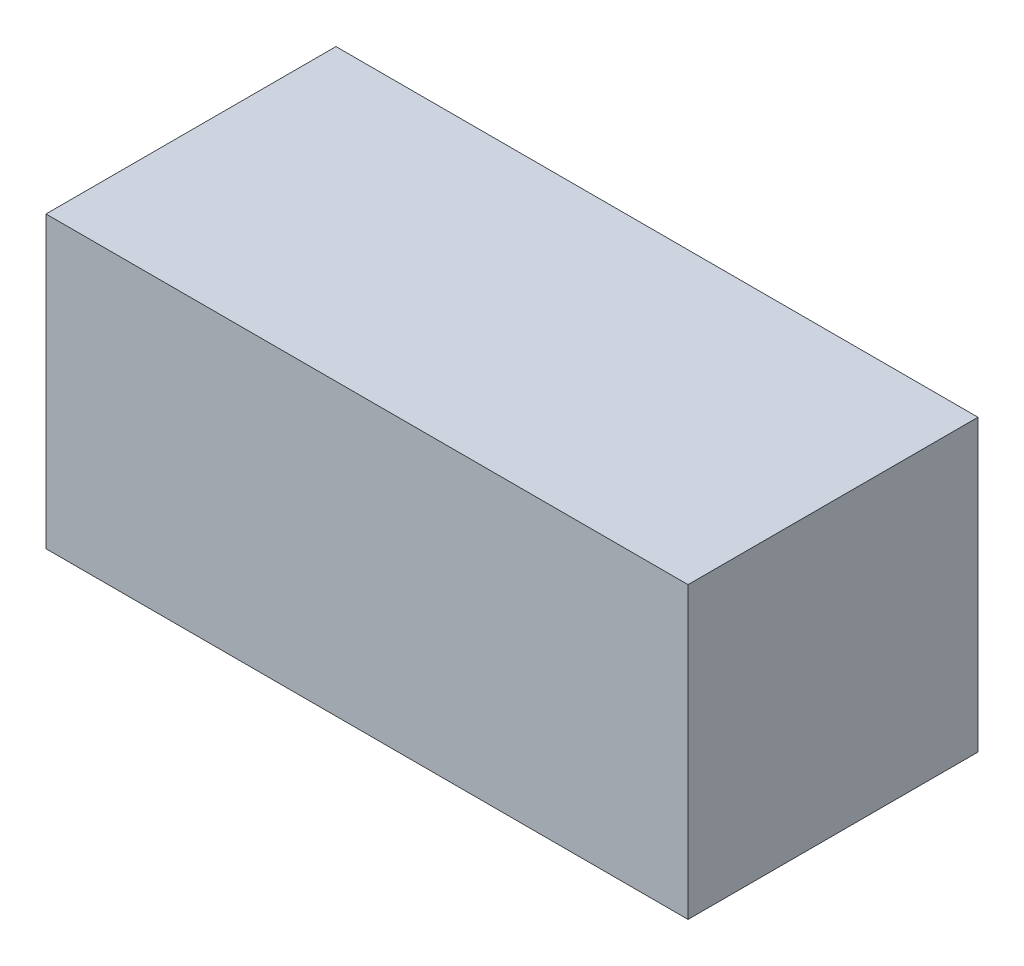
ISO-10303-21;
HEADER;
FILE_DESCRIPTION(('STEP AP214'),'2;1');
FILE_NAME('part.step','',(''),(''),'','','');
FILE_SCHEMA(('AUTOMOTIVE_DESIGN { 1 0 10303 214 1 1 1 1 }'));
ENDSEC;
DATA;
#1=APPLICATION_CONTEXT('core data for automotive mechanical design processes');
#2=APPLICATION_PROTOCOL_DEFINITION('international standard','automotive_design',2000,#1);
#3=PRODUCT_CONTEXT('',#1,'mechanical');
#4=PRODUCT('Part','Part','',(#3));
#5=PRODUCT_RELATED_PRODUCT_CATEGORY('part','',(#4));
#6=PRODUCT_DEFINITION_FORMATION('','',#4);
#7=PRODUCT_DEFINITION_CONTEXT('part definition',#1,'design');
#8=PRODUCT_DEFINITION('design','',#6,#7);
#9=PRODUCT_DEFINITION_SHAPE('','',#8);
#10=(LENGTH_UNIT() NAMED_UNIT(*) SI_UNIT(.MILLI.,.METRE.));
#11=(NAMED_UNIT(*) PLANE_ANGLE_UNIT() SI_UNIT($,.RADIAN.));
#12=(NAMED_UNIT(*) SI_UNIT($,.STERADIAN.) SOLID_ANGLE_UNIT());
#13=UNCERTAINTY_MEASURE_WITH_UNIT(LENGTH_MEASURE(1.E-05),#10,'distance_accuracy_value','');
#14=(GEOMETRIC_REPRESENTATION_CONTEXT(3) GLOBAL_UNCERTAINTY_ASSIGNED_CONTEXT((#13)) GLOBAL_UNIT_ASSIGNED_CONTEXT((#10,
#11,#12)) REPRESENTATION_CONTEXT('',''));
#15=CARTESIAN_POINT('',(0.,0.,0.));
#16=DIRECTION('',(0.,0.,1.));
#17=DIRECTION('',(1.,0.,0.));
#18=AXIS2_PLACEMENT_3D('',#15,#16,#17);
#19=CARTESIAN_POINT('',(-65.1146492550486,23.6367837338263,70.));
#20=DIRECTION('',(1.,0.,0.));
#21=DIRECTION('',(0.,1.,0.));
#22=AXIS2_PLACEMENT_3D('',#19,#20,#21);
#23=PLANE('',#22);
#24=DIRECTION('',(0.,0.,-1.));
#25=VECTOR('',#24,1.);
#26=CARTESIAN_POINT('',(-65.1146492550486,19.6367837338263,66.));
#27=LINE('',#26,#25);
#28=CARTESIAN_POINT('',(-65.1146492550486,19.6367837338263,66.));
#29=VERTEX_POINT('',#28);
#30=CARTESIAN_POINT('',(-65.1146492550486,19.6367837338263,4.));
#31=VERTEX_POINT('',#30);
#32=EDGE_CURVE('E154',#29,#31,#27,.T.);
#33=ORIENTED_EDGE('',*,*,#32,.F.);
#34=DIRECTION('',(0.,1.,0.));
#35=VECTOR('',#34,1.);
#36=CARTESIAN_POINT('',(-65.1146492550486,19.6367837338263,66.));
#37=LINE('',#36,#35);
#38=CARTESIAN_POINT('',(-65.1146492550486,-42.3632162661737,66.));
#39=VERTEX_POINT('',#38);
#40=EDGE_CURVE('E56',#39,#29,#37,.T.);
#41=ORIENTED_EDGE('',*,*,#40,.F.);
#42=DIRECTION('',(0.,0.,1.));
#43=VECTOR('',#42,1.);
#44=CARTESIAN_POINT('',(-65.1146492550486,-42.3632162661737,66.));
#45=LINE('',#44,#43);
#46=CARTESIAN_POINT('',(-65.1146492550486,-42.3632162661738,4.));
#47=VERTEX_POINT('',#46);
#48=EDGE_CURVE('E138',#47,#39,#45,.T.);
#49=ORIENTED_EDGE('',*,*,#48,.F.);
#50=DIRECTION('',(0.,-1.,0.));
#51=VECTOR('',#50,1.);
#52=CARTESIAN_POINT('',(-65.1146492550486,19.6367837338263,4.));
#53=LINE('',#52,#51);
#54=EDGE_CURVE('E142',#31,#47,#53,.T.);
#55=ORIENTED_EDGE('',*,*,#54,.F.);
#56=EDGE_LOOP('',(#33,#41,#49,#55));
#57=FACE_BOUND('',#56,.T.);
#58=DIRECTION('',(0.,-1.,0.));
#59=VECTOR('',#58,1.);
#60=CARTESIAN_POINT('',(-65.1146492550486,23.6367837338263,0.));
#61=LINE('',#60,#59);
#62=CARTESIAN_POINT('',(-65.1146492550486,23.6367837338263,0.));
#63=VERTEX_POINT('',#62);
#64=CARTESIAN_POINT('',(-65.1146492550486,-46.3632162661738,0.));
#65=VERTEX_POINT('',#64);
#66=EDGE_CURVE('E163',#63,#65,#61,.T.);
#67=ORIENTED_EDGE('',*,*,#66,.T.);
#68=DIRECTION('',(0.,0.,-1.));
#69=VECTOR('',#68,1.);
#70=CARTESIAN_POINT('',(-65.1146492550486,-46.3632162661738,70.));
#71=LINE('',#70,#69);
#72=CARTESIAN_POINT('',(-65.1146492550486,-46.3632162661738,70.));
#73=VERTEX_POINT('',#72);
#74=EDGE_CURVE('E11',#73,#65,#71,.T.);
#75=ORIENTED_EDGE('',*,*,#74,.F.);
#76=DIRECTION('',(0.,-1.,0.));
#77=VECTOR('',#76,1.);
#78=CARTESIAN_POINT('',(-65.1146492550486,23.6367837338263,70.));
#79=LINE('',#78,#77);
#80=CARTESIAN_POINT('',(-65.1146492550486,23.6367837338263,70.));
#81=VERTEX_POINT('',#80);
#82=EDGE_CURVE('E169',#81,#73,#79,.T.);
#83=ORIENTED_EDGE('',*,*,#82,.F.);
#84=DIRECTION('',(0.,0.,-1.));
#85=VECTOR('',#84,1.);
#86=CARTESIAN_POINT('',(-65.1146492550486,23.6367837338263,70.));
#87=LINE('',#86,#85);
#88=EDGE_CURVE('E179',#81,#63,#87,.T.);
#89=ORIENTED_EDGE('',*,*,#88,.T.);
#90=EDGE_LOOP('',(#67,#75,#83,#89));
#91=FACE_BOUND('',#90,.T.);
#92=ADVANCED_FACE('F39',(#57,#91),#23,.F.);
#93=CARTESIAN_POINT('',(-65.1146492550486,-46.3632162661738,70.));
#94=DIRECTION('',(0.,1.,0.));
#95=DIRECTION('',(0.,0.,1.));
#96=AXIS2_PLACEMENT_3D('',#93,#94,#95);
#97=PLANE('',#96);
#98=CARTESIAN_POINT('',(-60.1146492550486,-46.3632162661738,35.));
#99=DIRECTION('',(0.,-1.,0.));
#100=DIRECTION('',(0.,0.,-1.));
#101=AXIS2_PLACEMENT_3D('',#98,#99,#100);
#102=CIRCLE('',#101,2.5);
#103=CARTESIAN_POINT('',(-60.1146492550486,-46.3632162661738,32.5));
#104=VERTEX_POINT('',#103);
#105=EDGE_CURVE('E201',#104,#104,#102,.T.);
#106=ORIENTED_EDGE('',*,*,#105,.F.);
#107=EDGE_LOOP('',(#106));
#108=FACE_BOUND('',#107,.T.);
#109=CARTESIAN_POINT('',(49.8853507449514,-46.3632162661738,35.));
#110=DIRECTION('',(0.,-1.,0.));
#111=DIRECTION('',(0.,0.,-1.));
#112=AXIS2_PLACEMENT_3D('',#109,#110,#111);
#113=CIRCLE('',#112,2.5);
#114=CARTESIAN_POINT('',(49.8853507449514,-46.3632162661738,32.5));
#115=VERTEX_POINT('',#114);
#116=EDGE_CURVE('E145',#115,#115,#113,.T.);
#117=ORIENTED_EDGE('',*,*,#116,.F.);
#118=EDGE_LOOP('',(#117));
#119=FACE_BOUND('',#118,.T.);
#120=DIRECTION('',(1.,0.,0.));
#121=VECTOR('',#120,1.);
#122=CARTESIAN_POINT('',(-65.1146492550486,-46.3632162661738,0.));
#123=LINE('',#122,#121);
#124=CARTESIAN_POINT('',(89.8853507449513,-46.3632162661738,0.));
#125=VERTEX_POINT('',#124);
#126=EDGE_CURVE('E183',#65,#125,#123,.T.);
#127=ORIENTED_EDGE('',*,*,#126,.T.);
#128=DIRECTION('',(0.,0.,-1.));
#129=VECTOR('',#128,1.);
#130=CARTESIAN_POINT('',(89.8853507449513,-46.3632162661738,70.));
#131=LINE('',#130,#129);
#132=CARTESIAN_POINT('',(89.8853507449513,-46.3632162661738,70.));
#133=VERTEX_POINT('',#132);
#134=EDGE_CURVE('E48',#133,#125,#131,.T.);
#135=ORIENTED_EDGE('',*,*,#134,.F.);
#136=DIRECTION('',(1.,0.,0.));
#137=VECTOR('',#136,1.);
#138=CARTESIAN_POINT('',(-65.1146492550486,-46.3632162661738,70.));
#139=LINE('',#138,#137);
#140=EDGE_CURVE('E93',#73,#133,#139,.T.);
#141=ORIENTED_EDGE('',*,*,#140,.F.);
#142=ORIENTED_EDGE('',*,*,#74,.T.);
#143=EDGE_LOOP('',(#127,#135,#141,#142));
#144=FACE_BOUND('',#143,.T.);
#145=ADVANCED_FACE('F217',(#108,#119,#144),#97,.F.);
#146=CARTESIAN_POINT('',(89.8853507449513,23.6367837338263,70.));
#147=DIRECTION('',(-1.,0.,0.));
#148=DIRECTION('',(0.,0.,1.));
#149=AXIS2_PLACEMENT_3D('',#146,#147,#148);
#150=PLANE('',#149);
#151=DIRECTION('',(0.,1.,0.));
#152=VECTOR('',#151,1.);
#153=CARTESIAN_POINT('',(89.8853507449513,23.6367837338263,0.));
#154=LINE('',#153,#152);
#155=CARTESIAN_POINT('',(89.8853507449513,23.6367837338263,0.));
#156=VERTEX_POINT('',#155);
#157=EDGE_CURVE('E186',#125,#156,#154,.T.);
#158=ORIENTED_EDGE('',*,*,#157,.T.);
#159=DIRECTION('',(0.,0.,-1.));
#160=VECTOR('',#159,1.);
#161=CARTESIAN_POINT('',(89.8853507449513,23.6367837338263,70.));
#162=LINE('',#161,#160);
#163=CARTESIAN_POINT('',(89.8853507449513,23.6367837338263,70.));
#164=VERTEX_POINT('',#163);
#165=EDGE_CURVE('E193',#164,#156,#162,.T.);
#166=ORIENTED_EDGE('',*,*,#165,.F.);
#167=DIRECTION('',(0.,1.,0.));
#168=VECTOR('',#167,1.);
#169=CARTESIAN_POINT('',(89.8853507449513,23.6367837338263,70.));
#170=LINE('',#169,#168);
#171=EDGE_CURVE('E174',#133,#164,#170,.T.);
#172=ORIENTED_EDGE('',*,*,#171,.F.);
#173=ORIENTED_EDGE('',*,*,#134,.T.);
#174=EDGE_LOOP('',(#158,#166,#172,#173));
#175=FACE_BOUND('',#174,.T.);
#176=ADVANCED_FACE('F219',(#175),#150,.F.);
#177=CARTESIAN_POINT('',(-65.1146492550486,23.6367837338263,70.));
#178=DIRECTION('',(0.,-1.,0.));
#179=DIRECTION('',(0.,0.,-1.));
#180=AXIS2_PLACEMENT_3D('',#177,#178,#179);
#181=PLANE('',#180);
#182=DIRECTION('',(-1.,0.,0.));
#183=VECTOR('',#182,1.);
#184=CARTESIAN_POINT('',(-65.1146492550486,23.6367837338263,0.));
#185=LINE('',#184,#183);
#186=EDGE_CURVE('E86',#156,#63,#185,.T.);
#187=ORIENTED_EDGE('',*,*,#186,.T.);
#188=ORIENTED_EDGE('',*,*,#88,.F.);
#189=DIRECTION('',(-1.,0.,0.));
#190=VECTOR('',#189,1.);
#191=CARTESIAN_POINT('',(-65.1146492550486,23.6367837338263,70.));
#192=LINE('',#191,#190);
#193=EDGE_CURVE('E65',#164,#81,#192,.T.);
#194=ORIENTED_EDGE('',*,*,#193,.F.);
#195=ORIENTED_EDGE('',*,*,#165,.T.);
#196=EDGE_LOOP('',(#187,#188,#194,#195));
#197=FACE_BOUND('',#196,.T.);
#198=ADVANCED_FACE('F231',(#197),#181,.F.);
#199=CARTESIAN_POINT('',(0.,0.,70.));
#200=DIRECTION('',(0.,0.,1.));
#201=DIRECTION('',(1.,0.,0.));
#202=AXIS2_PLACEMENT_3D('',#199,#200,#201);
#203=PLANE('',#202);
#204=ORIENTED_EDGE('',*,*,#82,.T.);
#205=ORIENTED_EDGE('',*,*,#140,.T.);
#206=ORIENTED_EDGE('',*,*,#171,.T.);
#207=ORIENTED_EDGE('',*,*,#193,.T.);
#208=EDGE_LOOP('',(#204,#205,#206,#207));
#209=FACE_BOUND('',#208,.T.);
#210=ADVANCED_FACE('F233',(#209),#203,.T.);
#211=CARTESIAN_POINT('',(0.,0.,0.));
#212=DIRECTION('',(0.,0.,1.));
#213=DIRECTION('',(1.,0.,0.));
#214=AXIS2_PLACEMENT_3D('',#211,#212,#213);
#215=PLANE('',#214);
#216=ORIENTED_EDGE('',*,*,#66,.F.);
#217=ORIENTED_EDGE('',*,*,#186,.F.);
#218=ORIENTED_EDGE('',*,*,#157,.F.);
#219=ORIENTED_EDGE('',*,*,#126,.F.);
#220=EDGE_LOOP('',(#216,#217,#218,#219));
#221=FACE_BOUND('',#220,.T.);
#222=ADVANCED_FACE('F228',(#221),#215,.F.);
#223=CARTESIAN_POINT('',(85.8853507449514,19.6367837338263,66.));
#224=DIRECTION('',(0.,0.,1.));
#225=DIRECTION('',(0.,-1.,0.));
#226=AXIS2_PLACEMENT_3D('',#223,#224,#225);
#227=PLANE('',#226);
#228=ORIENTED_EDGE('',*,*,#40,.T.);
#229=DIRECTION('',(-1.,0.,0.));
#230=VECTOR('',#229,1.);
#231=CARTESIAN_POINT('',(85.8853507449514,19.6367837338263,66.));
#232=LINE('',#231,#230);
#233=CARTESIAN_POINT('',(85.8853507449514,19.6367837338263,66.));
#234=VERTEX_POINT('',#233);
#235=EDGE_CURVE('E113',#234,#29,#232,.T.);
#236=ORIENTED_EDGE('',*,*,#235,.F.);
#237=DIRECTION('',(0.,1.,0.));
#238=VECTOR('',#237,1.);
#239=CARTESIAN_POINT('',(85.8853507449514,19.6367837338263,66.));
#240=LINE('',#239,#238);
#241=CARTESIAN_POINT('',(85.8853507449514,-42.3632162661737,66.));
#242=VERTEX_POINT('',#241);
#243=EDGE_CURVE('E117',#242,#234,#240,.T.);
#244=ORIENTED_EDGE('',*,*,#243,.F.);
#245=DIRECTION('',(-1.,0.,0.));
#246=VECTOR('',#245,1.);
#247=CARTESIAN_POINT('',(85.8853507449514,-42.3632162661737,66.));
#248=LINE('',#247,#246);
#249=EDGE_CURVE('E160',#242,#39,#248,.T.);
#250=ORIENTED_EDGE('',*,*,#249,.T.);
#251=EDGE_LOOP('',(#228,#236,#244,#250));
#252=FACE_BOUND('',#251,.T.);
#253=ADVANCED_FACE('F115',(#252),#227,.F.);
#254=CARTESIAN_POINT('',(85.8853507449514,-42.3632162661737,66.));
#255=DIRECTION('',(0.,-1.,0.));
#256=DIRECTION('',(1.,0.,0.));
#257=AXIS2_PLACEMENT_3D('',#254,#255,#256);
#258=PLANE('',#257);
#259=CARTESIAN_POINT('',(-60.1146492550486,-42.3632162661738,35.));
#260=DIRECTION('',(0.,-1.,0.));
#261=DIRECTION('',(1.,0.,0.));
#262=AXIS2_PLACEMENT_3D('',#259,#260,#261);
#263=CIRCLE('',#262,2.5);
#264=CARTESIAN_POINT('',(-57.6146492550486,-42.3632162661738,35.));
#265=VERTEX_POINT('',#264);
#266=EDGE_CURVE('E42',#265,#265,#263,.T.);
#267=ORIENTED_EDGE('',*,*,#266,.T.);
#268=EDGE_LOOP('',(#267));
#269=FACE_BOUND('',#268,.T.);
#270=CARTESIAN_POINT('',(49.8853507449514,-42.3632162661737,35.));
#271=DIRECTION('',(0.,-1.,0.));
#272=DIRECTION('',(1.,0.,0.));
#273=AXIS2_PLACEMENT_3D('',#270,#271,#272);
#274=CIRCLE('',#273,2.5);
#275=CARTESIAN_POINT('',(52.3853507449514,-42.3632162661737,35.));
#276=VERTEX_POINT('',#275);
#277=EDGE_CURVE('E198',#276,#276,#274,.T.);
#278=ORIENTED_EDGE('',*,*,#277,.T.);
#279=EDGE_LOOP('',(#278));
#280=FACE_BOUND('',#279,.T.);
#281=ORIENTED_EDGE('',*,*,#48,.T.);
#282=ORIENTED_EDGE('',*,*,#249,.F.);
#283=DIRECTION('',(0.,0.,1.));
#284=VECTOR('',#283,1.);
#285=CARTESIAN_POINT('',(85.8853507449514,-42.3632162661737,66.));
#286=LINE('',#285,#284);
#287=CARTESIAN_POINT('',(85.8853507449514,-42.3632162661737,4.));
#288=VERTEX_POINT('',#287);
#289=EDGE_CURVE('E124',#288,#242,#286,.T.);
#290=ORIENTED_EDGE('',*,*,#289,.F.);
#291=DIRECTION('',(-1.,0.,0.));
#292=VECTOR('',#291,1.);
#293=CARTESIAN_POINT('',(85.8853507449514,-42.3632162661737,4.));
#294=LINE('',#293,#292);
#295=EDGE_CURVE('E164',#288,#47,#294,.T.);
#296=ORIENTED_EDGE('',*,*,#295,.T.);
#297=EDGE_LOOP('',(#281,#282,#290,#296));
#298=FACE_BOUND('',#297,.T.);
#299=ADVANCED_FACE('F251',(#269,#280,#298),#258,.F.);
#300=CARTESIAN_POINT('',(85.8853507449514,19.6367837338263,4.));
#301=DIRECTION('',(0.,0.,-1.));
#302=DIRECTION('',(0.,1.,0.));
#303=AXIS2_PLACEMENT_3D('',#300,#301,#302);
#304=PLANE('',#303);
#305=ORIENTED_EDGE('',*,*,#54,.T.);
#306=ORIENTED_EDGE('',*,*,#295,.F.);
#307=DIRECTION('',(0.,-1.,0.));
#308=VECTOR('',#307,1.);
#309=CARTESIAN_POINT('',(85.8853507449514,19.6367837338263,4.));
#310=LINE('',#309,#308);
#311=CARTESIAN_POINT('',(85.8853507449514,19.6367837338263,4.));
#312=VERTEX_POINT('',#311);
#313=EDGE_CURVE('E133',#312,#288,#310,.T.);
#314=ORIENTED_EDGE('',*,*,#313,.F.);
#315=DIRECTION('',(-1.,0.,0.));
#316=VECTOR('',#315,1.);
#317=CARTESIAN_POINT('',(85.8853507449514,19.6367837338263,4.));
#318=LINE('',#317,#316);
#319=EDGE_CURVE('E123',#312,#31,#318,.T.);
#320=ORIENTED_EDGE('',*,*,#319,.T.);
#321=EDGE_LOOP('',(#305,#306,#314,#320));
#322=FACE_BOUND('',#321,.T.);
#323=ADVANCED_FACE('F249',(#322),#304,.F.);
#324=CARTESIAN_POINT('',(85.8853507449514,19.6367837338263,66.));
#325=DIRECTION('',(0.,1.,0.));
#326=DIRECTION('',(-1.,0.,0.));
#327=AXIS2_PLACEMENT_3D('',#324,#325,#326);
#328=PLANE('',#327);
#329=ORIENTED_EDGE('',*,*,#32,.T.);
#330=ORIENTED_EDGE('',*,*,#319,.F.);
#331=DIRECTION('',(0.,0.,-1.));
#332=VECTOR('',#331,1.);
#333=CARTESIAN_POINT('',(85.8853507449514,19.6367837338263,66.));
#334=LINE('',#333,#332);
#335=EDGE_CURVE('E127',#234,#312,#334,.T.);
#336=ORIENTED_EDGE('',*,*,#335,.F.);
#337=ORIENTED_EDGE('',*,*,#235,.T.);
#338=EDGE_LOOP('',(#329,#330,#336,#337));
#339=FACE_BOUND('',#338,.T.);
#340=ADVANCED_FACE('F128',(#339),#328,.F.);
#341=CARTESIAN_POINT('',(85.8853507449514,0.,0.));
#342=DIRECTION('',(1.,0.,0.));
#343=DIRECTION('',(0.,1.,0.));
#344=AXIS2_PLACEMENT_3D('',#341,#342,#343);
#345=PLANE('',#344);
#346=ORIENTED_EDGE('',*,*,#243,.T.);
#347=ORIENTED_EDGE('',*,*,#335,.T.);
#348=ORIENTED_EDGE('',*,*,#313,.T.);
#349=ORIENTED_EDGE('',*,*,#289,.T.);
#350=EDGE_LOOP('',(#346,#347,#348,#349));
#351=FACE_BOUND('',#350,.T.);
#352=ADVANCED_FACE('F135',(#351),#345,.F.);
#353=CARTESIAN_POINT('',(49.8853507449514,-41.3632162661738,35.));
#354=DIRECTION('',(0.,-1.,0.));
#355=DIRECTION('',(0.,0.,-1.));
#356=AXIS2_PLACEMENT_3D('',#353,#354,#355);
#357=CYLINDRICAL_SURFACE('',#356,2.5);
#358=ORIENTED_EDGE('',*,*,#116,.T.);
#359=EDGE_LOOP('',(#358));
#360=FACE_BOUND('',#359,.T.);
#361=ORIENTED_EDGE('',*,*,#277,.F.);
#362=EDGE_LOOP('',(#361));
#363=FACE_BOUND('',#362,.T.);
#364=ADVANCED_FACE('F214',(#360,#363),#357,.F.);
#365=CARTESIAN_POINT('',(-60.1146492550486,-41.3632162661738,35.));
#366=DIRECTION('',(0.,-1.,0.));
#367=DIRECTION('',(0.,0.,-1.));
#368=AXIS2_PLACEMENT_3D('',#365,#366,#367);
#369=CYLINDRICAL_SURFACE('',#368,2.5);
#370=ORIENTED_EDGE('',*,*,#105,.T.);
#371=EDGE_LOOP('',(#370));
#372=FACE_BOUND('',#371,.T.);
#373=ORIENTED_EDGE('',*,*,#266,.F.);
#374=EDGE_LOOP('',(#373));
#375=FACE_BOUND('',#374,.T.);
#376=ADVANCED_FACE('F315',(#372,#375),#369,.F.);
#377=CLOSED_SHELL('',(#92,#145,#176,#198,#210,#222,#253,#299,#323,#340,#352,#364,#376));
#378=MANIFOLD_SOLID_BREP('B2',#377);
#379=ADVANCED_BREP_SHAPE_REPRESENTATION('',(#18,#378),#14);
#380=SHAPE_DEFINITION_REPRESENTATION(#9,#379);
ENDSEC;
END-ISO-10303-21;
